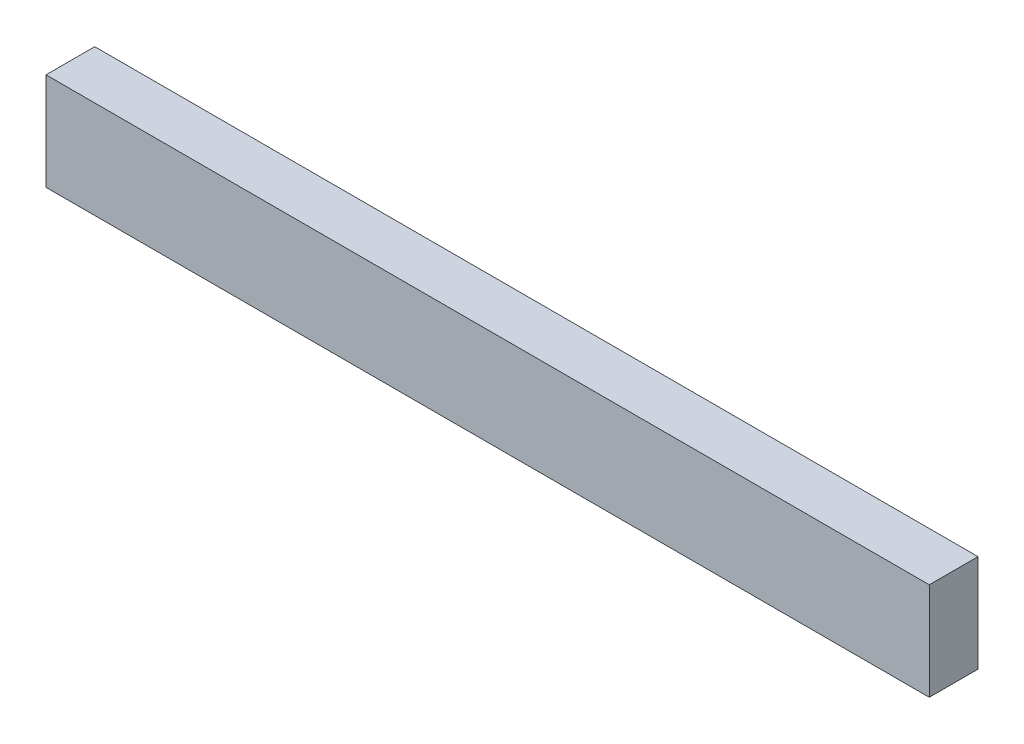
ISO-10303-21;
HEADER;
FILE_DESCRIPTION(('STEP AP214'),'2;1');
FILE_NAME('part.step','',(''),(''),'','','');
FILE_SCHEMA(('AUTOMOTIVE_DESIGN { 1 0 10303 214 1 1 1 1 }'));
ENDSEC;
DATA;
#1=APPLICATION_CONTEXT('core data for automotive mechanical design processes');
#2=APPLICATION_PROTOCOL_DEFINITION('international standard','automotive_design',2000,#1);
#3=PRODUCT_CONTEXT('',#1,'mechanical');
#4=PRODUCT('Part','Part','',(#3));
#5=PRODUCT_RELATED_PRODUCT_CATEGORY('part','',(#4));
#6=PRODUCT_DEFINITION_FORMATION('','',#4);
#7=PRODUCT_DEFINITION_CONTEXT('part definition',#1,'design');
#8=PRODUCT_DEFINITION('design','',#6,#7);
#9=PRODUCT_DEFINITION_SHAPE('','',#8);
#10=(LENGTH_UNIT() NAMED_UNIT(*) SI_UNIT(.MILLI.,.METRE.));
#11=(NAMED_UNIT(*) PLANE_ANGLE_UNIT() SI_UNIT($,.RADIAN.));
#12=(NAMED_UNIT(*) SI_UNIT($,.STERADIAN.) SOLID_ANGLE_UNIT());
#13=UNCERTAINTY_MEASURE_WITH_UNIT(LENGTH_MEASURE(1.E-05),#10,'distance_accuracy_value','');
#14=(GEOMETRIC_REPRESENTATION_CONTEXT(3) GLOBAL_UNCERTAINTY_ASSIGNED_CONTEXT((#13)) GLOBAL_UNIT_ASSIGNED_CONTEXT((#10,
#11,#12)) REPRESENTATION_CONTEXT('',''));
#15=CARTESIAN_POINT('',(0.,0.,0.));
#16=DIRECTION('',(0.,0.,1.));
#17=DIRECTION('',(1.,0.,0.));
#18=AXIS2_PLACEMENT_3D('',#15,#16,#17);
#19=CARTESIAN_POINT('',(217.5,-24.,12.));
#20=DIRECTION('',(-1.,0.,0.));
#21=DIRECTION('',(0.,0.,1.));
#22=AXIS2_PLACEMENT_3D('',#19,#20,#21);
#23=PLANE('',#22);
#24=DIRECTION('',(0.,1.,0.));
#25=VECTOR('',#24,1.);
#26=CARTESIAN_POINT('',(217.5,-24.,-12.));
#27=LINE('',#26,#25);
#28=CARTESIAN_POINT('',(217.5,-24.,-12.));
#29=VERTEX_POINT('',#28);
#30=CARTESIAN_POINT('',(217.5,24.,-12.));
#31=VERTEX_POINT('',#30);
#32=EDGE_CURVE('E112',#29,#31,#27,.T.);
#33=ORIENTED_EDGE('',*,*,#32,.T.);
#34=DIRECTION('',(0.,0.,-1.));
#35=VECTOR('',#34,1.);
#36=CARTESIAN_POINT('',(217.5,24.,12.));
#37=LINE('',#36,#35);
#38=CARTESIAN_POINT('',(217.5,24.,12.));
#39=VERTEX_POINT('',#38);
#40=EDGE_CURVE('E11',#39,#31,#37,.T.);
#41=ORIENTED_EDGE('',*,*,#40,.F.);
#42=DIRECTION('',(0.,1.,0.));
#43=VECTOR('',#42,1.);
#44=CARTESIAN_POINT('',(217.5,-24.,12.));
#45=LINE('',#44,#43);
#46=CARTESIAN_POINT('',(217.5,-24.,12.));
#47=VERTEX_POINT('',#46);
#48=EDGE_CURVE('E95',#47,#39,#45,.T.);
#49=ORIENTED_EDGE('',*,*,#48,.F.);
#50=DIRECTION('',(0.,0.,-1.));
#51=VECTOR('',#50,1.);
#52=CARTESIAN_POINT('',(217.5,-24.,12.));
#53=LINE('',#52,#51);
#54=EDGE_CURVE('E108',#47,#29,#53,.T.);
#55=ORIENTED_EDGE('',*,*,#54,.T.);
#56=EDGE_LOOP('',(#33,#41,#49,#55));
#57=FACE_BOUND('',#56,.T.);
#58=ADVANCED_FACE('F43',(#57),#23,.F.);
#59=CARTESIAN_POINT('',(-217.5,24.,12.));
#60=DIRECTION('',(0.,-1.,0.));
#61=DIRECTION('',(0.,0.,-1.));
#62=AXIS2_PLACEMENT_3D('',#59,#60,#61);
#63=PLANE('',#62);
#64=DIRECTION('',(-1.,0.,0.));
#65=VECTOR('',#64,1.);
#66=CARTESIAN_POINT('',(-217.5,24.,-12.));
#67=LINE('',#66,#65);
#68=CARTESIAN_POINT('',(-217.5,24.,-12.));
#69=VERTEX_POINT('',#68);
#70=EDGE_CURVE('E100',#31,#69,#67,.T.);
#71=ORIENTED_EDGE('',*,*,#70,.T.);
#72=DIRECTION('',(0.,0.,-1.));
#73=VECTOR('',#72,1.);
#74=CARTESIAN_POINT('',(-217.5,24.,12.));
#75=LINE('',#74,#73);
#76=CARTESIAN_POINT('',(-217.5,24.,12.));
#77=VERTEX_POINT('',#76);
#78=EDGE_CURVE('E52',#77,#69,#75,.T.);
#79=ORIENTED_EDGE('',*,*,#78,.F.);
#80=DIRECTION('',(-1.,0.,0.));
#81=VECTOR('',#80,1.);
#82=CARTESIAN_POINT('',(-217.5,24.,12.));
#83=LINE('',#82,#81);
#84=EDGE_CURVE('E90',#39,#77,#83,.T.);
#85=ORIENTED_EDGE('',*,*,#84,.F.);
#86=ORIENTED_EDGE('',*,*,#40,.T.);
#87=EDGE_LOOP('',(#71,#79,#85,#86));
#88=FACE_BOUND('',#87,.T.);
#89=ADVANCED_FACE('F99',(#88),#63,.F.);
#90=CARTESIAN_POINT('',(-217.5,-24.,12.));
#91=DIRECTION('',(1.,0.,0.));
#92=DIRECTION('',(0.,0.,-1.));
#93=AXIS2_PLACEMENT_3D('',#90,#91,#92);
#94=PLANE('',#93);
#95=DIRECTION('',(0.,-1.,0.));
#96=VECTOR('',#95,1.);
#97=CARTESIAN_POINT('',(-217.5,-24.,-12.));
#98=LINE('',#97,#96);
#99=CARTESIAN_POINT('',(-217.5,-24.,-12.));
#100=VERTEX_POINT('',#99);
#101=EDGE_CURVE('E77',#69,#100,#98,.T.);
#102=ORIENTED_EDGE('',*,*,#101,.T.);
#103=DIRECTION('',(0.,0.,-1.));
#104=VECTOR('',#103,1.);
#105=CARTESIAN_POINT('',(-217.5,-24.,12.));
#106=LINE('',#105,#104);
#107=CARTESIAN_POINT('',(-217.5,-24.,12.));
#108=VERTEX_POINT('',#107);
#109=EDGE_CURVE('E102',#108,#100,#106,.T.);
#110=ORIENTED_EDGE('',*,*,#109,.F.);
#111=DIRECTION('',(0.,-1.,0.));
#112=VECTOR('',#111,1.);
#113=CARTESIAN_POINT('',(-217.5,-24.,12.));
#114=LINE('',#113,#112);
#115=EDGE_CURVE('E93',#77,#108,#114,.T.);
#116=ORIENTED_EDGE('',*,*,#115,.F.);
#117=ORIENTED_EDGE('',*,*,#78,.T.);
#118=EDGE_LOOP('',(#102,#110,#116,#117));
#119=FACE_BOUND('',#118,.T.);
#120=ADVANCED_FACE('F103',(#119),#94,.F.);
#121=CARTESIAN_POINT('',(-217.5,-24.,12.));
#122=DIRECTION('',(0.,1.,0.));
#123=DIRECTION('',(0.,0.,1.));
#124=AXIS2_PLACEMENT_3D('',#121,#122,#123);
#125=PLANE('',#124);
#126=DIRECTION('',(1.,0.,0.));
#127=VECTOR('',#126,1.);
#128=CARTESIAN_POINT('',(-217.5,-24.,-12.));
#129=LINE('',#128,#127);
#130=EDGE_CURVE('E83',#100,#29,#129,.T.);
#131=ORIENTED_EDGE('',*,*,#130,.T.);
#132=ORIENTED_EDGE('',*,*,#54,.F.);
#133=DIRECTION('',(1.,0.,0.));
#134=VECTOR('',#133,1.);
#135=CARTESIAN_POINT('',(-217.5,-24.,12.));
#136=LINE('',#135,#134);
#137=EDGE_CURVE('E60',#108,#47,#136,.T.);
#138=ORIENTED_EDGE('',*,*,#137,.F.);
#139=ORIENTED_EDGE('',*,*,#109,.T.);
#140=EDGE_LOOP('',(#131,#132,#138,#139));
#141=FACE_BOUND('',#140,.T.);
#142=ADVANCED_FACE('F126',(#141),#125,.F.);
#143=CARTESIAN_POINT('',(0.,0.,12.));
#144=DIRECTION('',(0.,0.,-1.));
#145=DIRECTION('',(-1.,0.,0.));
#146=AXIS2_PLACEMENT_3D('',#143,#144,#145);
#147=PLANE('',#146);
#148=ORIENTED_EDGE('',*,*,#48,.T.);
#149=ORIENTED_EDGE('',*,*,#84,.T.);
#150=ORIENTED_EDGE('',*,*,#115,.T.);
#151=ORIENTED_EDGE('',*,*,#137,.T.);
#152=EDGE_LOOP('',(#148,#149,#150,#151));
#153=FACE_BOUND('',#152,.T.);
#154=ADVANCED_FACE('F91',(#153),#147,.F.);
#155=CARTESIAN_POINT('',(0.,0.,-12.));
#156=DIRECTION('',(0.,0.,-1.));
#157=DIRECTION('',(-1.,0.,0.));
#158=AXIS2_PLACEMENT_3D('',#155,#156,#157);
#159=PLANE('',#158);
#160=ORIENTED_EDGE('',*,*,#32,.F.);
#161=ORIENTED_EDGE('',*,*,#130,.F.);
#162=ORIENTED_EDGE('',*,*,#101,.F.);
#163=ORIENTED_EDGE('',*,*,#70,.F.);
#164=EDGE_LOOP('',(#160,#161,#162,#163));
#165=FACE_BOUND('',#164,.T.);
#166=ADVANCED_FACE('F129',(#165),#159,.T.);
#167=CLOSED_SHELL('',(#58,#89,#120,#142,#154,#166));
#168=MANIFOLD_SOLID_BREP('B2',#167);
#169=ADVANCED_BREP_SHAPE_REPRESENTATION('',(#18,#168),#14);
#170=SHAPE_DEFINITION_REPRESENTATION(#9,#169);
ENDSEC;
END-ISO-10303-21;
